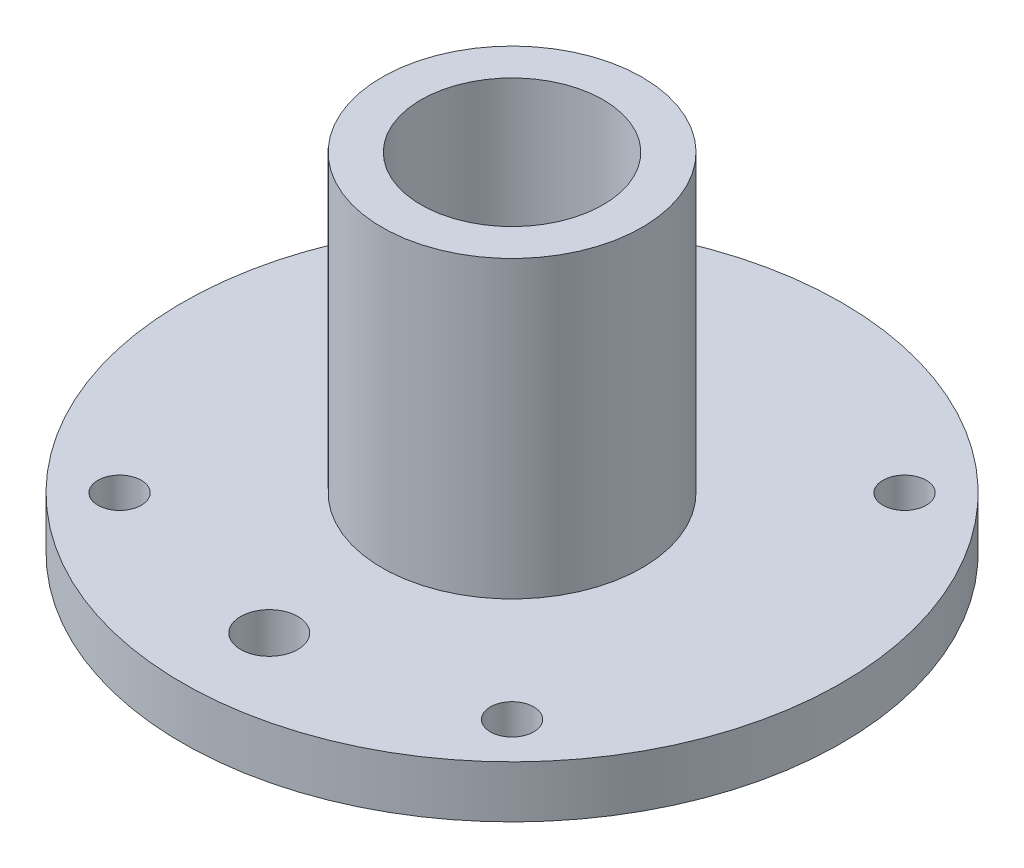
ISO-10303-21;
HEADER;
FILE_DESCRIPTION(('STEP AP214'),'2;1');
FILE_NAME('part.step','',(''),(''),'','','');
FILE_SCHEMA(('AUTOMOTIVE_DESIGN { 1 0 10303 214 1 1 1 1 }'));
ENDSEC;
DATA;
#1=APPLICATION_CONTEXT('core data for automotive mechanical design processes');
#2=APPLICATION_PROTOCOL_DEFINITION('international standard','automotive_design',2000,#1);
#3=PRODUCT_CONTEXT('',#1,'mechanical');
#4=PRODUCT('Part','Part','',(#3));
#5=PRODUCT_RELATED_PRODUCT_CATEGORY('part','',(#4));
#6=PRODUCT_DEFINITION_FORMATION('','',#4);
#7=PRODUCT_DEFINITION_CONTEXT('part definition',#1,'design');
#8=PRODUCT_DEFINITION('design','',#6,#7);
#9=PRODUCT_DEFINITION_SHAPE('','',#8);
#10=(LENGTH_UNIT() NAMED_UNIT(*) SI_UNIT(.MILLI.,.METRE.));
#11=(NAMED_UNIT(*) PLANE_ANGLE_UNIT() SI_UNIT($,.RADIAN.));
#12=(NAMED_UNIT(*) SI_UNIT($,.STERADIAN.) SOLID_ANGLE_UNIT());
#13=UNCERTAINTY_MEASURE_WITH_UNIT(LENGTH_MEASURE(1.E-05),#10,'distance_accuracy_value','');
#14=(GEOMETRIC_REPRESENTATION_CONTEXT(3) GLOBAL_UNCERTAINTY_ASSIGNED_CONTEXT((#13)) GLOBAL_UNIT_ASSIGNED_CONTEXT((#10,
#11,#12)) REPRESENTATION_CONTEXT('',''));
#15=CARTESIAN_POINT('',(0.,0.,0.));
#16=DIRECTION('',(0.,0.,1.));
#17=DIRECTION('',(1.,0.,0.));
#18=AXIS2_PLACEMENT_3D('',#15,#16,#17);
#19=CARTESIAN_POINT('',(0.,20.,0.));
#20=DIRECTION('',(0.,1.,0.));
#21=DIRECTION('',(0.,0.,1.));
#22=AXIS2_PLACEMENT_3D('',#19,#20,#21);
#23=PLANE('',#22);
#24=CARTESIAN_POINT('',(0.,20.,0.));
#25=DIRECTION('',(0.,-1.,0.));
#26=DIRECTION('',(0.,0.,-1.));
#27=AXIS2_PLACEMENT_3D('',#24,#25,#26);
#28=CIRCLE('',#27,5.25);
#29=CARTESIAN_POINT('',(0.,20.,-5.25));
#30=VERTEX_POINT('',#29);
#31=EDGE_CURVE('E177',#30,#30,#28,.T.);
#32=ORIENTED_EDGE('',*,*,#31,.T.);
#33=EDGE_LOOP('',(#32));
#34=FACE_BOUND('',#33,.T.);
#35=CARTESIAN_POINT('',(0.,20.,0.));
#36=DIRECTION('',(0.,-1.,0.));
#37=DIRECTION('',(0.,0.,-1.));
#38=AXIS2_PLACEMENT_3D('',#35,#36,#37);
#39=CIRCLE('',#38,7.49999999999995);
#40=CARTESIAN_POINT('',(0.,20.,-7.49999999999995));
#41=VERTEX_POINT('',#40);
#42=EDGE_CURVE('E80',#41,#41,#39,.T.);
#43=ORIENTED_EDGE('',*,*,#42,.F.);
#44=EDGE_LOOP('',(#43));
#45=FACE_BOUND('',#44,.T.);
#46=ADVANCED_FACE('F15',(#34,#45),#23,.T.);
#47=CARTESIAN_POINT('',(0.,6.,-7.5));
#48=DIRECTION('',(0.,0.,-1.));
#49=DIRECTION('',(-1.,0.,0.));
#50=AXIS2_PLACEMENT_3D('',#47,#48,#49);
#51=CYLINDRICAL_SURFACE('',#50,1.64999999999999);
#52=CARTESIAN_POINT('',(0.,7.64999999999999,-5.25));
#53=CARTESIAN_POINT('',(-0.0902592663763617,7.64999616433016,-5.24999732025957));
#54=CARTESIAN_POINT('',(-0.180565154730796,7.64256473204704,-5.24764860894502));
#55=CARTESIAN_POINT('',(-0.358575349818435,7.61309611318949,-5.23850071069979));
#56=CARTESIAN_POINT('',(-0.446277254485816,7.59104585348399,-5.23169754036211));
#57=CARTESIAN_POINT('',(-0.616425711889659,7.53316003489891,-5.21438605194276));
#58=CARTESIAN_POINT('',(-0.698881520151147,7.49734958574578,-5.20388448562661));
#59=CARTESIAN_POINT('',(-0.856603582345671,7.41305693156044,-5.18026045251086));
#60=CARTESIAN_POINT('',(-0.931869789311598,7.36457464375535,-5.16713796859147));
#61=CARTESIAN_POINT('',(-1.07543989790597,7.25472184352974,-5.13920533060858));
#62=CARTESIAN_POINT('',(-1.14348877711714,7.19302749887887,-5.12435811884539));
#63=CARTESIAN_POINT('',(-1.26847789799338,7.05917514734864,-5.09485989265403));
#64=CARTESIAN_POINT('',(-1.32541385741208,6.98701312545823,-5.08020895587575));
#65=CARTESIAN_POINT('',(-1.42795323389588,6.83204572697311,-5.05236089591882));
#66=CARTESIAN_POINT('',(-1.47323153976493,6.74901630449465,-5.03921023399037));
#67=CARTESIAN_POINT('',(-1.54903433940609,6.57609086162654,-5.0164304176916));
#68=CARTESIAN_POINT('',(-1.57957684613891,6.48620338103016,-5.00679696742472));
#69=CARTESIAN_POINT('',(-1.61804000627903,6.32991482947906,-4.99446824841974));
#70=CARTESIAN_POINT('',(-1.63000099025721,6.26457624823086,-4.99055783536774));
#71=CARTESIAN_POINT('',(-1.6459821384355,6.13283354107752,-4.98530977349599));
#72=CARTESIAN_POINT('',(-1.6500028986914,6.06642949553183,-4.98397193155898));
#73=CARTESIAN_POINT('',(-1.64999606689084,5.90986468726997,-4.98397755547151));
#74=CARTESIAN_POINT('',(-1.64258433472893,5.81968251957891,-4.98644823409452));
#75=CARTESIAN_POINT('',(-1.61320109480445,5.6419298303858,-4.99602947522901));
#76=CARTESIAN_POINT('',(-1.59121607243537,5.55436181197324,-5.00314434445797));
#77=CARTESIAN_POINT('',(-1.53352076551419,5.3844974213867,-5.02112718648047));
#78=CARTESIAN_POINT('',(-1.4978385353762,5.30219067250262,-5.03198748335724));
#79=CARTESIAN_POINT('',(-1.41384858700405,5.14472269062877,-5.05622732904153));
#80=CARTESIAN_POINT('',(-1.36554050136218,5.06956166566372,-5.06960695115732));
#81=CARTESIAN_POINT('',(-1.2558718722119,4.92589225555772,-5.09790010785376));
#82=CARTESIAN_POINT('',(-1.19414821976953,4.85766788219948,-5.11284867716615));
#83=CARTESIAN_POINT('',(-1.06016134744663,4.73233452942878,-5.14230068159465));
#84=CARTESIAN_POINT('',(-0.987894589358883,4.67522929661704,-5.15680396528976));
#85=CARTESIAN_POINT('',(-0.832816362314332,4.5724959711903,-5.18413480500305));
#86=CARTESIAN_POINT('',(-0.749798521754744,4.52716612593601,-5.19691547146395));
#87=CARTESIAN_POINT('',(-0.576896478125083,4.45126467565351,-5.21893209172125));
#88=CARTESIAN_POINT('',(-0.487020534317817,4.42067563321993,-5.22817223106425));
#89=CARTESIAN_POINT('',(-0.330612757080147,4.38209606832418,-5.23998035317095));
#90=CARTESIAN_POINT('',(-0.26513316265941,4.37008368645875,-5.24371712465736));
#91=CARTESIAN_POINT('',(-0.133110787898975,4.35403448479016,-5.24872786000138));
#92=CARTESIAN_POINT('',(-0.0665680736524741,4.34999717111427,-5.25000197636393));
#93=CARTESIAN_POINT('',(0.0902592663763608,4.35000383566984,-5.24999732025957));
#94=CARTESIAN_POINT('',(0.180565154730795,4.35743526795296,-5.24764860894502));
#95=CARTESIAN_POINT('',(0.358575349818434,4.38690388681051,-5.23850071069979));
#96=CARTESIAN_POINT('',(0.446277254485815,4.40895414651601,-5.23169754036211));
#97=CARTESIAN_POINT('',(0.616425711889657,4.46683996510109,-5.21438605194276));
#98=CARTESIAN_POINT('',(0.698881520151145,4.50265041425422,-5.20388448562661));
#99=CARTESIAN_POINT('',(0.85660358234567,4.58694306843956,-5.18026045251086));
#100=CARTESIAN_POINT('',(0.931869789311597,4.63542535624465,-5.16713796859147));
#101=CARTESIAN_POINT('',(1.07543989790597,4.74527815647026,-5.13920533060858));
#102=CARTESIAN_POINT('',(1.14348877711714,4.80697250112113,-5.12435811884539));
#103=CARTESIAN_POINT('',(1.26847789799338,4.94082485265136,-5.09485989265403));
#104=CARTESIAN_POINT('',(1.32541385741208,5.01298687454177,-5.08020895587575));
#105=CARTESIAN_POINT('',(1.42795323389588,5.16795427302689,-5.05236089591882));
#106=CARTESIAN_POINT('',(1.47323153976493,5.25098369550535,-5.03921023399037));
#107=CARTESIAN_POINT('',(1.54903433940609,5.42390913837346,-5.0164304176916));
#108=CARTESIAN_POINT('',(1.57957684613891,5.51379661896983,-5.00679696742472));
#109=CARTESIAN_POINT('',(1.61804000627904,5.67008517052097,-4.99446824841974));
#110=CARTESIAN_POINT('',(1.63000099025722,5.7354237517692,-4.99055783536774));
#111=CARTESIAN_POINT('',(1.64598213843551,5.86716645892259,-4.98530977349599));
#112=CARTESIAN_POINT('',(1.65000289869141,5.93357050446832,-4.98397193155898));
#113=CARTESIAN_POINT('',(1.64999606689083,6.0901353127302,-4.98397755547152));
#114=CARTESIAN_POINT('',(1.64258433472891,6.18031748042127,-4.98644823409453));
#115=CARTESIAN_POINT('',(1.61320109480441,6.35807016961438,-4.99602947522903));
#116=CARTESIAN_POINT('',(1.59121607243532,6.44563818802694,-5.00314434445798));
#117=CARTESIAN_POINT('',(1.53352076551412,6.61550257861347,-5.02112718648049));
#118=CARTESIAN_POINT('',(1.49783853537612,6.69780932749754,-5.03198748335726));
#119=CARTESIAN_POINT('',(1.41384858700396,6.85527730937139,-5.05622732904155));
#120=CARTESIAN_POINT('',(1.36554050136208,6.93043833433643,-5.06960695115735));
#121=CARTESIAN_POINT('',(1.25587187221178,7.07410774444242,-5.09790010785379));
#122=CARTESIAN_POINT('',(1.19414821976939,7.14233211780066,-5.11284867716618));
#123=CARTESIAN_POINT('',(1.06016134744648,7.26766547057135,-5.14230068159468));
#124=CARTESIAN_POINT('',(0.987894589358725,7.32477070338308,-5.15680396528979));
#125=CARTESIAN_POINT('',(0.83281636231416,7.4275040288098,-5.18413480500308));
#126=CARTESIAN_POINT('',(0.749798521754567,7.47283387406408,-5.19691547146398));
#127=CARTESIAN_POINT('',(0.576896478124897,7.54873532434656,-5.21893209172126));
#128=CARTESIAN_POINT('',(0.487020534317627,7.57932436678013,-5.22817223106427));
#129=CARTESIAN_POINT('',(0.330612757079984,7.61790393167585,-5.23998035317096));
#130=CARTESIAN_POINT('',(0.265133162659278,7.62991631354127,-5.24371712465737));
#131=CARTESIAN_POINT('',(0.133110787898908,7.64596551520985,-5.24872786000138));
#132=CARTESIAN_POINT('',(0.0665680736524401,7.65000282888573,-5.25000197636393));
#133=CARTESIAN_POINT('',(0.,7.64999999999999,-5.25));
#134=B_SPLINE_CURVE_WITH_KNOTS('',3,(#52,#53,#54,#55,#56,#57,#58,#59,#60,#61,#62,#63,#64,#65,
#66,#67,#68,#69,#70,#71,#72,#73,#74,#75,#76,#77,#78,#79,#80,#81,#82,#83,#84,#85,#86,#87,#88,#89,
#90,#91,#92,#93,#94,#95,#96,#97,#98,#99,#100,#101,#102,#103,#104,#105,#106,#107,#108,#109,#110,
#111,#112,#113,#114,#115,#116,#117,#118,#119,#120,#121,#122,#123,#124,#125,#126,#127,#128,#129,
#130,#131,#132,#133),.UNSPECIFIED.,.T.,.F.,(4,2,2,2,2,2,2,2,2,2,2,2,2,2,2,2,2,2,2,2,2,2,2,2,2,2,
2,2,2,2,2,2,2,2,2,2,2,2,2,2,4),(0.,0.270528698437973,0.541299648605569,0.811578822005902,
1.08185976092328,1.3597344033489,1.63771591135231,1.92276854081862,2.20747183507102,
2.4065910889523,2.60569539480472,2.87585142610114,3.14625833896082,3.41611433837729,
3.68597819137794,3.96433979572529,4.24279503247632,4.52773489115145,4.81233685212827,
5.01186971305557,5.21139021710703,5.481918915545,5.7526898657126,6.02296903911293,
6.29324997803031,6.57112462045593,6.84910612845934,7.13415875792564,7.41886205217805,
7.61798130605941,7.81708561191192,8.08724164320835,8.35764855606803,8.6275045554845,
8.89736840848516,9.17573001283252,9.45418524958355,9.73912510825868,10.0237270692355,
10.2232599301627,10.4227804342141),.UNSPECIFIED.);
#135=CARTESIAN_POINT('',(0.,7.64999999999999,-5.25));
#136=VERTEX_POINT('',#135);
#137=EDGE_CURVE('E18',#136,#136,#134,.T.);
#138=ORIENTED_EDGE('',*,*,#137,.T.);
#139=EDGE_LOOP('',(#138));
#140=FACE_BOUND('',#139,.T.);
#141=CARTESIAN_POINT('',(0.,4.35000000000001,-7.49999999999995));
#142=CARTESIAN_POINT('',(0.0914767131529261,4.35000397286639,-7.49999786168839));
#143=CARTESIAN_POINT('',(0.183007746807434,4.35763478624116,-7.49830893395254));
#144=CARTESIAN_POINT('',(0.363487491700573,4.38793085726421,-7.49173252693948));
#145=CARTESIAN_POINT('',(0.452433522120448,4.41061117955229,-7.48684184275251));
#146=CARTESIAN_POINT('',(0.625082483324632,4.47026085363231,-7.47440674359806));
#147=CARTESIAN_POINT('',(0.708791325733436,4.507213743925,-7.46686538672551));
#148=CARTESIAN_POINT('',(0.868809838298086,4.59430828191158,-7.44994307103451));
#149=CARTESIAN_POINT('',(0.945120352597245,4.64444842252121,-7.44056232245921));
#150=CARTESIAN_POINT('',(1.08942190625529,4.75735229239881,-7.42081847131837));
#151=CARTESIAN_POINT('',(1.15727649498757,4.82028828195961,-7.41044311217362));
#152=CARTESIAN_POINT('',(1.28157097414047,4.95664558704969,-7.38996306565821));
#153=CARTESIAN_POINT('',(1.33800740693572,5.03007006723575,-7.37985846107819));
#154=CARTESIAN_POINT('',(1.43847107578961,5.18634690337385,-7.36094096658802));
#155=CARTESIAN_POINT('',(1.48234663197292,5.26929882100216,-7.3521444357192));
#156=CARTESIAN_POINT('',(1.55543851989532,5.44156914246461,-7.33703053561115));
#157=CARTESIAN_POINT('',(1.5846717140352,5.53088008706483,-7.33071031644383));
#158=CARTESIAN_POINT('',(1.62068232004192,5.68387801411947,-7.3228136805598));
#159=CARTESIAN_POINT('',(1.63165855352567,5.74656390848141,-7.32036523692103));
#160=CARTESIAN_POINT('',(1.64631868508842,5.87282444805062,-7.31708212369562));
#161=CARTESIAN_POINT('',(1.65000278082902,5.93639906912091,-7.31624741036702));
#162=CARTESIAN_POINT('',(1.64999600167486,6.09144654254791,-7.31625138056581));
#163=CARTESIAN_POINT('',(1.64237005091199,6.18294747588096,-7.31798270826731));
#164=CARTESIAN_POINT('',(1.61209505268556,6.36336462944563,-7.32471024314464));
#165=CARTESIAN_POINT('',(1.58943083665166,6.45227814521925,-7.32970974673932));
#166=CARTESIAN_POINT('',(1.52982823902324,6.62485825987346,-7.34238018055349));
#167=CARTESIAN_POINT('',(1.49290706625112,6.70853104359436,-7.3500478890246));
#168=CARTESIAN_POINT('',(1.40588730790842,6.86848866960439,-7.3671866059379));
#169=CARTESIAN_POINT('',(1.35579015470104,6.94477431371821,-7.37665741833346));
#170=CARTESIAN_POINT('',(1.24293055546159,7.08910193414715,-7.3965159432678));
#171=CARTESIAN_POINT('',(1.17998618662815,7.15700004713804,-7.40691546009231));
#172=CARTESIAN_POINT('',(1.04359359911844,7.28137911466717,-7.42735880362149));
#173=CARTESIAN_POINT('',(0.970142332822733,7.33785674508026,-7.43740252606656));
#174=CARTESIAN_POINT('',(0.813840098423294,7.43836510558723,-7.45613323012916));
#175=CARTESIAN_POINT('',(0.730894173754832,7.48225129843834,-7.46480398153092));
#176=CARTESIAN_POINT('',(0.558636712418787,7.5553645642969,-7.47966356229014));
#177=CARTESIAN_POINT('',(0.469332568148942,7.58460835341828,-7.48585522021335));
#178=CARTESIAN_POINT('',(0.316306756365281,7.62064785426977,-7.49358442126982));
#179=CARTESIAN_POINT('',(0.253583732157708,7.63163708514079,-7.49597812460356));
#180=CARTESIAN_POINT('',(0.127249220210735,7.64631444933997,-7.49918663816358));
#181=CARTESIAN_POINT('',(0.0636377545538043,7.65000276381044,-7.50000148756265));
#182=CARTESIAN_POINT('',(-0.0914767131529266,7.64999602713361,-7.49999786168839));
#183=CARTESIAN_POINT('',(-0.183007746807435,7.64236521375884,-7.49830893395254));
#184=CARTESIAN_POINT('',(-0.363487491700573,7.61206914273579,-7.49173252693948));
#185=CARTESIAN_POINT('',(-0.452433522120448,7.58938882044771,-7.48684184275251));
#186=CARTESIAN_POINT('',(-0.625082483324633,7.52973914636769,-7.47440674359806));
#187=CARTESIAN_POINT('',(-0.708791325733437,7.492786256075,-7.46686538672551));
#188=CARTESIAN_POINT('',(-0.868809838298087,7.40569171808842,-7.4499430710345));
#189=CARTESIAN_POINT('',(-0.945120352597246,7.35555157747879,-7.44056232245921));
#190=CARTESIAN_POINT('',(-1.08942190625529,7.24264770760119,-7.42081847131837));
#191=CARTESIAN_POINT('',(-1.15727649498757,7.17971171804039,-7.41044311217362));
#192=CARTESIAN_POINT('',(-1.28157097414047,7.04335441295031,-7.38996306565821));
#193=CARTESIAN_POINT('',(-1.33800740693572,6.96992993276425,-7.37985846107819));
#194=CARTESIAN_POINT('',(-1.43847107578961,6.81365309662615,-7.36094096658802));
#195=CARTESIAN_POINT('',(-1.48234663197292,6.73070117899784,-7.3521444357192));
#196=CARTESIAN_POINT('',(-1.55543851989532,6.55843085753539,-7.33703053561115));
#197=CARTESIAN_POINT('',(-1.5846717140352,6.46911991293517,-7.33071031644383));
#198=CARTESIAN_POINT('',(-1.62068232004192,6.31612198588053,-7.3228136805598));
#199=CARTESIAN_POINT('',(-1.63165855352567,6.25343609151859,-7.32036523692103));
#200=CARTESIAN_POINT('',(-1.64631868508842,6.12717555194938,-7.31708212369562));
#201=CARTESIAN_POINT('',(-1.65000278082902,6.06360093087909,-7.31624741036702));
#202=CARTESIAN_POINT('',(-1.64999600167486,5.90855345745209,-7.31625138056581));
#203=CARTESIAN_POINT('',(-1.64237005091199,5.81705252411904,-7.31798270826731));
#204=CARTESIAN_POINT('',(-1.61209505268556,5.63663537055437,-7.32471024314464));
#205=CARTESIAN_POINT('',(-1.58943083665166,5.54772185478075,-7.32970974673932));
#206=CARTESIAN_POINT('',(-1.52982823902324,5.37514174012654,-7.34238018055349));
#207=CARTESIAN_POINT('',(-1.49290706625112,5.29146895640564,-7.3500478890246));
#208=CARTESIAN_POINT('',(-1.40588730790842,5.13151133039561,-7.3671866059379));
#209=CARTESIAN_POINT('',(-1.35579015470104,5.05522568628179,-7.37665741833346));
#210=CARTESIAN_POINT('',(-1.24293055546159,4.91089806585285,-7.3965159432678));
#211=CARTESIAN_POINT('',(-1.17998618662815,4.84299995286196,-7.40691546009231));
#212=CARTESIAN_POINT('',(-1.04359359911844,4.71862088533283,-7.42735880362149));
#213=CARTESIAN_POINT('',(-0.970142332822734,4.66214325491974,-7.43740252606656));
#214=CARTESIAN_POINT('',(-0.813840098423294,4.56163489441277,-7.45613323012916));
#215=CARTESIAN_POINT('',(-0.730894173754832,4.51774870156166,-7.46480398153092));
#216=CARTESIAN_POINT('',(-0.558636712418787,4.4446354357031,-7.47966356229014));
#217=CARTESIAN_POINT('',(-0.469332568148942,4.41539164658172,-7.48585522021335));
#218=CARTESIAN_POINT('',(-0.316306756365281,4.37935214573023,-7.49358442126982));
#219=CARTESIAN_POINT('',(-0.253583732157708,4.36836291485921,-7.49597812460356));
#220=CARTESIAN_POINT('',(-0.127249220210735,4.35368555066003,-7.49918663816358));
#221=CARTESIAN_POINT('',(-0.0636377545538047,4.34999723618956,-7.50000148756265));
#222=CARTESIAN_POINT('',(0.,4.35000000000001,-7.49999999999995));
#223=B_SPLINE_CURVE_WITH_KNOTS('',3,(#141,#142,#143,#144,#145,#146,#147,#148,#149,#150,#151,
#152,#153,#154,#155,#156,#157,#158,#159,#160,#161,#162,#163,#164,#165,#166,#167,#168,#169,#170,
#171,#172,#173,#174,#175,#176,#177,#178,#179,#180,#181,#182,#183,#184,#185,#186,#187,#188,#189,
#190,#191,#192,#193,#194,#195,#196,#197,#198,#199,#200,#201,#202,#203,#204,#205,#206,#207,#208,
#209,#210,#211,#212,#213,#214,#215,#216,#217,#218,#219,#220,#221,#222),.UNSPECIFIED.,.T.,.F.,(4,
2,2,2,2,2,2,2,2,2,2,2,2,2,2,2,2,2,2,2,2,2,2,2,2,2,2,2,2,2,2,2,2,2,2,2,2,2,2,2,4),(0.,
0.274195265934385,0.548665417705806,0.822819945633109,1.09694315584327,1.37503526851709,
1.6532114669141,1.93461732982155,2.21569837138912,2.40634286394457,2.59698218879581,
2.87108677956752,3.14546827116874,3.419519601383,3.69354115173318,3.97175205820903,
4.2500438264953,4.53141281044441,4.8124598403184,5.00321444198377,5.19396431079658,
5.46815957673096,5.74262972850238,6.01678425642969,6.29090746663985,6.56899957931367,
6.84717577771068,7.12858164061813,7.4096626821857,7.60030717474114,7.79094649959238,
8.06505109036409,8.33943258196532,8.61348391217958,8.88750546252975,9.16571636900561,
9.44400813729188,9.72537712124099,10.006424151115,10.1971787527803,10.3879286215932),.UNSPECIFIED.);
#224=CARTESIAN_POINT('',(0.,4.35000000000001,-7.49999999999995));
#225=VERTEX_POINT('',#224);
#226=EDGE_CURVE('E74',#225,#225,#223,.T.);
#227=ORIENTED_EDGE('',*,*,#226,.F.);
#228=EDGE_LOOP('',(#227));
#229=FACE_BOUND('',#228,.T.);
#230=ADVANCED_FACE('F81',(#140,#229),#51,.F.);
#231=CARTESIAN_POINT('',(0.,20.,0.));
#232=DIRECTION('',(0.,-1.,0.));
#233=DIRECTION('',(0.,0.,-1.));
#234=AXIS2_PLACEMENT_3D('',#231,#232,#233);
#235=CYLINDRICAL_SURFACE('',#234,5.25);
#236=ORIENTED_EDGE('',*,*,#137,.F.);
#237=EDGE_LOOP('',(#236));
#238=FACE_BOUND('',#237,.T.);
#239=CARTESIAN_POINT('',(0.,3.,0.));
#240=DIRECTION('',(0.,-1.,0.));
#241=DIRECTION('',(0.,0.,-1.));
#242=AXIS2_PLACEMENT_3D('',#239,#240,#241);
#243=CIRCLE('',#242,5.25);
#244=CARTESIAN_POINT('',(0.,3.,-5.25));
#245=VERTEX_POINT('',#244);
#246=EDGE_CURVE('E71',#245,#245,#243,.F.);
#247=ORIENTED_EDGE('',*,*,#246,.F.);
#248=EDGE_LOOP('',(#247));
#249=FACE_BOUND('',#248,.T.);
#250=ORIENTED_EDGE('',*,*,#31,.F.);
#251=EDGE_LOOP('',(#250));
#252=FACE_BOUND('',#251,.T.);
#253=ADVANCED_FACE('F88',(#238,#249,#252),#235,.F.);
#254=CARTESIAN_POINT('',(0.,20.,0.));
#255=DIRECTION('',(0.,-1.,0.));
#256=DIRECTION('',(0.,0.,-1.));
#257=AXIS2_PLACEMENT_3D('',#254,#255,#256);
#258=CYLINDRICAL_SURFACE('',#257,7.49999999999995);
#259=CARTESIAN_POINT('',(0.,3.,0.));
#260=DIRECTION('',(0.,-1.,0.));
#261=DIRECTION('',(0.,0.,-1.));
#262=AXIS2_PLACEMENT_3D('',#259,#260,#261);
#263=CIRCLE('',#262,7.49999999999995);
#264=CARTESIAN_POINT('',(0.,3.,-7.49999999999995));
#265=VERTEX_POINT('',#264);
#266=EDGE_CURVE('E68',#265,#265,#263,.T.);
#267=ORIENTED_EDGE('',*,*,#266,.F.);
#268=EDGE_LOOP('',(#267));
#269=FACE_BOUND('',#268,.T.);
#270=ORIENTED_EDGE('',*,*,#226,.T.);
#271=EDGE_LOOP('',(#270));
#272=FACE_BOUND('',#271,.T.);
#273=ORIENTED_EDGE('',*,*,#42,.T.);
#274=EDGE_LOOP('',(#273));
#275=FACE_BOUND('',#274,.T.);
#276=ADVANCED_FACE('F83',(#269,#272,#275),#258,.T.);
#277=CARTESIAN_POINT('',(0.,3.,0.));
#278=DIRECTION('',(0.,1.,0.));
#279=DIRECTION('',(0.,0.,1.));
#280=AXIS2_PLACEMENT_3D('',#277,#278,#279);
#281=PLANE('',#280);
#282=ORIENTED_EDGE('',*,*,#246,.T.);
#283=EDGE_LOOP('',(#282));
#284=FACE_BOUND('',#283,.T.);
#285=CARTESIAN_POINT('',(0.,3.,0.));
#286=DIRECTION('',(0.,1.,0.));
#287=DIRECTION('',(0.,0.,1.));
#288=AXIS2_PLACEMENT_3D('',#285,#286,#287);
#289=CIRCLE('',#288,2.5);
#290=CARTESIAN_POINT('',(0.,3.,2.5));
#291=VERTEX_POINT('',#290);
#292=EDGE_CURVE('E50',#291,#291,#289,.F.);
#293=ORIENTED_EDGE('',*,*,#292,.T.);
#294=EDGE_LOOP('',(#293));
#295=FACE_BOUND('',#294,.T.);
#296=ADVANCED_FACE('F87',(#284,#295),#281,.T.);
#297=CARTESIAN_POINT('',(0.,3.,0.));
#298=DIRECTION('',(0.,1.,0.));
#299=DIRECTION('',(0.,0.,1.));
#300=AXIS2_PLACEMENT_3D('',#297,#298,#299);
#301=PLANE('',#300);
#302=ORIENTED_EDGE('',*,*,#266,.T.);
#303=EDGE_LOOP('',(#302));
#304=FACE_BOUND('',#303,.T.);
#305=CARTESIAN_POINT('',(0.,3.,0.));
#306=DIRECTION('',(0.,-1.,0.));
#307=DIRECTION('',(0.,0.,-1.));
#308=AXIS2_PLACEMENT_3D('',#305,#306,#307);
#309=CIRCLE('',#308,19.);
#310=CARTESIAN_POINT('',(0.,3.,-19.));
#311=VERTEX_POINT('',#310);
#312=EDGE_CURVE('E47',#311,#311,#309,.T.);
#313=ORIENTED_EDGE('',*,*,#312,.F.);
#314=EDGE_LOOP('',(#313));
#315=FACE_BOUND('',#314,.T.);
#316=CARTESIAN_POINT('',(11.3137084989848,3.,11.3137084989847));
#317=DIRECTION('',(0.,-1.,0.));
#318=DIRECTION('',(0.,0.,-1.));
#319=AXIS2_PLACEMENT_3D('',#316,#317,#318);
#320=CIRCLE('',#319,1.25);
#321=CARTESIAN_POINT('',(11.3137084989848,3.,10.0637084989847));
#322=VERTEX_POINT('',#321);
#323=EDGE_CURVE('E53',#322,#322,#320,.T.);
#324=ORIENTED_EDGE('',*,*,#323,.T.);
#325=EDGE_LOOP('',(#324));
#326=FACE_BOUND('',#325,.T.);
#327=CARTESIAN_POINT('',(11.3137084989847,3.,-11.3137084989849));
#328=DIRECTION('',(0.,-1.,0.));
#329=DIRECTION('',(0.,0.,-1.));
#330=AXIS2_PLACEMENT_3D('',#327,#328,#329);
#331=CIRCLE('',#330,1.25);
#332=CARTESIAN_POINT('',(11.3137084989847,3.,-12.5637084989849));
#333=VERTEX_POINT('',#332);
#334=EDGE_CURVE('E56',#333,#333,#331,.T.);
#335=ORIENTED_EDGE('',*,*,#334,.T.);
#336=EDGE_LOOP('',(#335));
#337=FACE_BOUND('',#336,.T.);
#338=CARTESIAN_POINT('',(-11.3137084989848,3.,-11.3137084989847));
#339=DIRECTION('',(0.,-1.,0.));
#340=DIRECTION('',(0.,0.,-1.));
#341=AXIS2_PLACEMENT_3D('',#338,#339,#340);
#342=CIRCLE('',#341,1.25);
#343=CARTESIAN_POINT('',(-11.3137084989848,3.,-12.5637084989847));
#344=VERTEX_POINT('',#343);
#345=EDGE_CURVE('E59',#344,#344,#342,.T.);
#346=ORIENTED_EDGE('',*,*,#345,.T.);
#347=EDGE_LOOP('',(#346));
#348=FACE_BOUND('',#347,.T.);
#349=CARTESIAN_POINT('',(-11.3137084989846,3.,11.3137084989849));
#350=DIRECTION('',(0.,-1.,0.));
#351=DIRECTION('',(0.,0.,-1.));
#352=AXIS2_PLACEMENT_3D('',#349,#350,#351);
#353=CIRCLE('',#352,1.25);
#354=CARTESIAN_POINT('',(-11.3137084989846,3.,10.0637084989849));
#355=VERTEX_POINT('',#354);
#356=EDGE_CURVE('E62',#355,#355,#353,.T.);
#357=ORIENTED_EDGE('',*,*,#356,.T.);
#358=EDGE_LOOP('',(#357));
#359=FACE_BOUND('',#358,.T.);
#360=CARTESIAN_POINT('',(0.,3.,14.));
#361=DIRECTION('',(0.,-1.,0.));
#362=DIRECTION('',(0.,0.,-1.));
#363=AXIS2_PLACEMENT_3D('',#360,#361,#362);
#364=CIRCLE('',#363,1.64999999999999);
#365=CARTESIAN_POINT('',(0.,3.,12.35));
#366=VERTEX_POINT('',#365);
#367=EDGE_CURVE('E65',#366,#366,#364,.T.);
#368=ORIENTED_EDGE('',*,*,#367,.T.);
#369=EDGE_LOOP('',(#368));
#370=FACE_BOUND('',#369,.T.);
#371=ADVANCED_FACE('F135',(#304,#315,#326,#337,#348,#359,#370),#301,.T.);
#372=CARTESIAN_POINT('',(0.,0.,14.));
#373=DIRECTION('',(0.,-1.,0.));
#374=DIRECTION('',(0.,0.,-1.));
#375=AXIS2_PLACEMENT_3D('',#372,#373,#374);
#376=CYLINDRICAL_SURFACE('',#375,1.64999999999999);
#377=ORIENTED_EDGE('',*,*,#367,.F.);
#378=EDGE_LOOP('',(#377));
#379=FACE_BOUND('',#378,.T.);
#380=CARTESIAN_POINT('',(0.,0.,14.));
#381=DIRECTION('',(0.,-1.,0.));
#382=DIRECTION('',(0.,0.,-1.));
#383=AXIS2_PLACEMENT_3D('',#380,#381,#382);
#384=CIRCLE('',#383,1.64999999999999);
#385=CARTESIAN_POINT('',(0.,0.,12.35));
#386=VERTEX_POINT('',#385);
#387=EDGE_CURVE('E44',#386,#386,#384,.T.);
#388=ORIENTED_EDGE('',*,*,#387,.T.);
#389=EDGE_LOOP('',(#388));
#390=FACE_BOUND('',#389,.T.);
#391=ADVANCED_FACE('F132',(#379,#390),#376,.F.);
#392=CARTESIAN_POINT('',(-11.3137084989846,0.,11.3137084989849));
#393=DIRECTION('',(0.,-1.,0.));
#394=DIRECTION('',(0.,0.,-1.));
#395=AXIS2_PLACEMENT_3D('',#392,#393,#394);
#396=CYLINDRICAL_SURFACE('',#395,1.25);
#397=ORIENTED_EDGE('',*,*,#356,.F.);
#398=EDGE_LOOP('',(#397));
#399=FACE_BOUND('',#398,.T.);
#400=CARTESIAN_POINT('',(-11.3137084989846,0.,11.3137084989849));
#401=DIRECTION('',(0.,-1.,0.));
#402=DIRECTION('',(0.,0.,-1.));
#403=AXIS2_PLACEMENT_3D('',#400,#401,#402);
#404=CIRCLE('',#403,1.25);
#405=CARTESIAN_POINT('',(-11.3137084989846,0.,10.0637084989849));
#406=VERTEX_POINT('',#405);
#407=EDGE_CURVE('E41',#406,#406,#404,.T.);
#408=ORIENTED_EDGE('',*,*,#407,.T.);
#409=EDGE_LOOP('',(#408));
#410=FACE_BOUND('',#409,.T.);
#411=ADVANCED_FACE('F128',(#399,#410),#396,.F.);
#412=CARTESIAN_POINT('',(-11.3137084989848,0.,-11.3137084989847));
#413=DIRECTION('',(0.,-1.,0.));
#414=DIRECTION('',(0.,0.,-1.));
#415=AXIS2_PLACEMENT_3D('',#412,#413,#414);
#416=CYLINDRICAL_SURFACE('',#415,1.25);
#417=ORIENTED_EDGE('',*,*,#345,.F.);
#418=EDGE_LOOP('',(#417));
#419=FACE_BOUND('',#418,.T.);
#420=CARTESIAN_POINT('',(-11.3137084989848,0.,-11.3137084989847));
#421=DIRECTION('',(0.,-1.,0.));
#422=DIRECTION('',(0.,0.,-1.));
#423=AXIS2_PLACEMENT_3D('',#420,#421,#422);
#424=CIRCLE('',#423,1.25);
#425=CARTESIAN_POINT('',(-11.3137084989848,0.,-12.5637084989847));
#426=VERTEX_POINT('',#425);
#427=EDGE_CURVE('E38',#426,#426,#424,.T.);
#428=ORIENTED_EDGE('',*,*,#427,.T.);
#429=EDGE_LOOP('',(#428));
#430=FACE_BOUND('',#429,.T.);
#431=ADVANCED_FACE('F124',(#419,#430),#416,.F.);
#432=CARTESIAN_POINT('',(11.3137084989847,0.,-11.3137084989849));
#433=DIRECTION('',(0.,-1.,0.));
#434=DIRECTION('',(0.,0.,-1.));
#435=AXIS2_PLACEMENT_3D('',#432,#433,#434);
#436=CYLINDRICAL_SURFACE('',#435,1.25);
#437=ORIENTED_EDGE('',*,*,#334,.F.);
#438=EDGE_LOOP('',(#437));
#439=FACE_BOUND('',#438,.T.);
#440=CARTESIAN_POINT('',(11.3137084989847,0.,-11.3137084989849));
#441=DIRECTION('',(0.,-1.,0.));
#442=DIRECTION('',(0.,0.,-1.));
#443=AXIS2_PLACEMENT_3D('',#440,#441,#442);
#444=CIRCLE('',#443,1.25);
#445=CARTESIAN_POINT('',(11.3137084989847,0.,-12.5637084989849));
#446=VERTEX_POINT('',#445);
#447=EDGE_CURVE('E35',#446,#446,#444,.T.);
#448=ORIENTED_EDGE('',*,*,#447,.T.);
#449=EDGE_LOOP('',(#448));
#450=FACE_BOUND('',#449,.T.);
#451=ADVANCED_FACE('F120',(#439,#450),#436,.F.);
#452=CARTESIAN_POINT('',(11.3137084989848,0.,11.3137084989847));
#453=DIRECTION('',(0.,-1.,0.));
#454=DIRECTION('',(0.,0.,-1.));
#455=AXIS2_PLACEMENT_3D('',#452,#453,#454);
#456=CYLINDRICAL_SURFACE('',#455,1.25);
#457=ORIENTED_EDGE('',*,*,#323,.F.);
#458=EDGE_LOOP('',(#457));
#459=FACE_BOUND('',#458,.T.);
#460=CARTESIAN_POINT('',(11.3137084989848,0.,11.3137084989847));
#461=DIRECTION('',(0.,-1.,0.));
#462=DIRECTION('',(0.,0.,-1.));
#463=AXIS2_PLACEMENT_3D('',#460,#461,#462);
#464=CIRCLE('',#463,1.25);
#465=CARTESIAN_POINT('',(11.3137084989848,0.,10.0637084989847));
#466=VERTEX_POINT('',#465);
#467=EDGE_CURVE('E30',#466,#466,#464,.T.);
#468=ORIENTED_EDGE('',*,*,#467,.T.);
#469=EDGE_LOOP('',(#468));
#470=FACE_BOUND('',#469,.T.);
#471=ADVANCED_FACE('F116',(#459,#470),#456,.F.);
#472=CARTESIAN_POINT('',(0.,-8.,0.));
#473=DIRECTION('',(0.,1.,0.));
#474=DIRECTION('',(0.,0.,1.));
#475=AXIS2_PLACEMENT_3D('',#472,#473,#474);
#476=CYLINDRICAL_SURFACE('',#475,2.5);
#477=CARTESIAN_POINT('',(0.,0.,0.));
#478=DIRECTION('',(0.,1.,0.));
#479=DIRECTION('',(0.,0.,1.));
#480=AXIS2_PLACEMENT_3D('',#477,#478,#479);
#481=CIRCLE('',#480,2.5);
#482=CARTESIAN_POINT('',(0.,0.,2.5));
#483=VERTEX_POINT('',#482);
#484=EDGE_CURVE('E25',#483,#483,#481,.F.);
#485=ORIENTED_EDGE('',*,*,#484,.T.);
#486=EDGE_LOOP('',(#485));
#487=FACE_BOUND('',#486,.T.);
#488=ORIENTED_EDGE('',*,*,#292,.F.);
#489=EDGE_LOOP('',(#488));
#490=FACE_BOUND('',#489,.T.);
#491=ADVANCED_FACE('F109',(#487,#490),#476,.F.);
#492=CARTESIAN_POINT('',(0.,3.,0.));
#493=DIRECTION('',(0.,-1.,0.));
#494=DIRECTION('',(0.,0.,-1.));
#495=AXIS2_PLACEMENT_3D('',#492,#493,#494);
#496=CYLINDRICAL_SURFACE('',#495,19.);
#497=ORIENTED_EDGE('',*,*,#312,.T.);
#498=EDGE_LOOP('',(#497));
#499=FACE_BOUND('',#498,.T.);
#500=CARTESIAN_POINT('',(0.,0.,0.));
#501=DIRECTION('',(0.,-1.,0.));
#502=DIRECTION('',(0.,0.,-1.));
#503=AXIS2_PLACEMENT_3D('',#500,#501,#502);
#504=CIRCLE('',#503,19.);
#505=CARTESIAN_POINT('',(0.,0.,-19.));
#506=VERTEX_POINT('',#505);
#507=EDGE_CURVE('E10',#506,#506,#504,.F.);
#508=ORIENTED_EDGE('',*,*,#507,.T.);
#509=EDGE_LOOP('',(#508));
#510=FACE_BOUND('',#509,.T.);
#511=ADVANCED_FACE('F103',(#499,#510),#496,.T.);
#512=CARTESIAN_POINT('',(0.,0.,0.));
#513=DIRECTION('',(0.,1.,0.));
#514=DIRECTION('',(0.,0.,1.));
#515=AXIS2_PLACEMENT_3D('',#512,#513,#514);
#516=PLANE('',#515);
#517=ORIENTED_EDGE('',*,*,#507,.F.);
#518=EDGE_LOOP('',(#517));
#519=FACE_BOUND('',#518,.T.);
#520=ORIENTED_EDGE('',*,*,#484,.F.);
#521=EDGE_LOOP('',(#520));
#522=FACE_BOUND('',#521,.T.);
#523=ORIENTED_EDGE('',*,*,#467,.F.);
#524=EDGE_LOOP('',(#523));
#525=FACE_BOUND('',#524,.T.);
#526=ORIENTED_EDGE('',*,*,#447,.F.);
#527=EDGE_LOOP('',(#526));
#528=FACE_BOUND('',#527,.T.);
#529=ORIENTED_EDGE('',*,*,#427,.F.);
#530=EDGE_LOOP('',(#529));
#531=FACE_BOUND('',#530,.T.);
#532=ORIENTED_EDGE('',*,*,#407,.F.);
#533=EDGE_LOOP('',(#532));
#534=FACE_BOUND('',#533,.T.);
#535=ORIENTED_EDGE('',*,*,#387,.F.);
#536=EDGE_LOOP('',(#535));
#537=FACE_BOUND('',#536,.T.);
#538=ADVANCED_FACE('F101',(#519,#522,#525,#528,#531,#534,#537),#516,.F.);
#539=CLOSED_SHELL('',(#46,#230,#253,#276,#296,#371,#391,#411,#431,#451,#471,#491,#511,#538));
#540=MANIFOLD_SOLID_BREP('B1',#539);
#541=ADVANCED_BREP_SHAPE_REPRESENTATION('',(#18,#540),#14);
#542=SHAPE_DEFINITION_REPRESENTATION(#9,#541);
ENDSEC;
END-ISO-10303-21;
